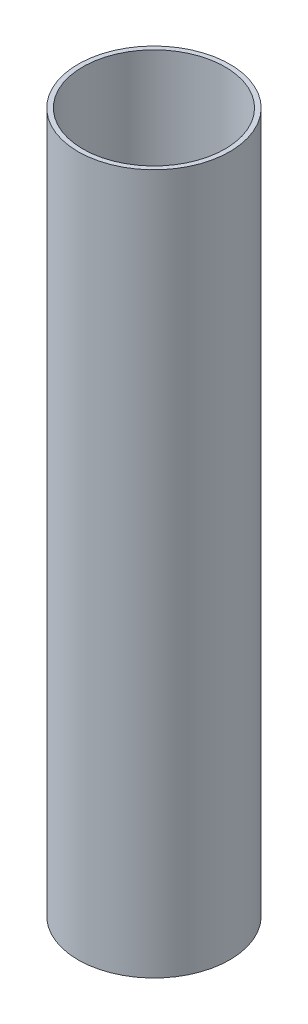
ISO-10303-21;
HEADER;
FILE_DESCRIPTION(('STEP AP214'),'2;1');
FILE_NAME('part.step','',(''),(''),'','','');
FILE_SCHEMA(('AUTOMOTIVE_DESIGN { 1 0 10303 214 1 1 1 1 }'));
ENDSEC;
DATA;
#1=APPLICATION_CONTEXT('core data for automotive mechanical design processes');
#2=APPLICATION_PROTOCOL_DEFINITION('international standard','automotive_design',2000,#1);
#3=PRODUCT_CONTEXT('',#1,'mechanical');
#4=PRODUCT('Part','Part','',(#3));
#5=PRODUCT_RELATED_PRODUCT_CATEGORY('part','',(#4));
#6=PRODUCT_DEFINITION_FORMATION('','',#4);
#7=PRODUCT_DEFINITION_CONTEXT('part definition',#1,'design');
#8=PRODUCT_DEFINITION('design','',#6,#7);
#9=PRODUCT_DEFINITION_SHAPE('','',#8);
#10=(LENGTH_UNIT() NAMED_UNIT(*) SI_UNIT(.MILLI.,.METRE.));
#11=(NAMED_UNIT(*) PLANE_ANGLE_UNIT() SI_UNIT($,.RADIAN.));
#12=(NAMED_UNIT(*) SI_UNIT($,.STERADIAN.) SOLID_ANGLE_UNIT());
#13=UNCERTAINTY_MEASURE_WITH_UNIT(LENGTH_MEASURE(1.E-05),#10,'distance_accuracy_value','');
#14=(GEOMETRIC_REPRESENTATION_CONTEXT(3) GLOBAL_UNCERTAINTY_ASSIGNED_CONTEXT((#13)) GLOBAL_UNIT_ASSIGNED_CONTEXT((#10,
#11,#12)) REPRESENTATION_CONTEXT('',''));
#15=CARTESIAN_POINT('',(0.,0.,0.));
#16=DIRECTION('',(0.,0.,1.));
#17=DIRECTION('',(1.,0.,0.));
#18=AXIS2_PLACEMENT_3D('',#15,#16,#17);
#19=CARTESIAN_POINT('',(0.,300.,0.));
#20=DIRECTION('',(0.,1.,0.));
#21=DIRECTION('',(0.,0.,1.));
#22=AXIS2_PLACEMENT_3D('',#19,#20,#21);
#23=PLANE('',#22);
#24=CARTESIAN_POINT('',(0.,300.,0.));
#25=DIRECTION('',(0.,1.,0.));
#26=DIRECTION('',(0.,0.,1.));
#27=AXIS2_PLACEMENT_3D('',#24,#25,#26);
#28=CIRCLE('',#27,32.5);
#29=CARTESIAN_POINT('',(0.,300.,32.5));
#30=VERTEX_POINT('',#29);
#31=EDGE_CURVE('E10',#30,#30,#28,.T.);
#32=ORIENTED_EDGE('',*,*,#31,.T.);
#33=EDGE_LOOP('',(#32));
#34=FACE_BOUND('',#33,.T.);
#35=CARTESIAN_POINT('',(0.,300.,0.));
#36=DIRECTION('',(0.,1.,0.));
#37=DIRECTION('',(0.,0.,1.));
#38=AXIS2_PLACEMENT_3D('',#35,#36,#37);
#39=CIRCLE('',#38,30.5);
#40=CARTESIAN_POINT('',(0.,300.,30.5));
#41=VERTEX_POINT('',#40);
#42=EDGE_CURVE('E46',#41,#41,#39,.T.);
#43=ORIENTED_EDGE('',*,*,#42,.F.);
#44=EDGE_LOOP('',(#43));
#45=FACE_BOUND('',#44,.T.);
#46=ADVANCED_FACE('F35',(#34,#45),#23,.T.);
#47=CARTESIAN_POINT('',(0.,0.,0.));
#48=DIRECTION('',(0.,1.,0.));
#49=DIRECTION('',(0.,0.,1.));
#50=AXIS2_PLACEMENT_3D('',#47,#48,#49);
#51=PLANE('',#50);
#52=CARTESIAN_POINT('',(0.,0.,0.));
#53=DIRECTION('',(0.,1.,0.));
#54=DIRECTION('',(0.,0.,1.));
#55=AXIS2_PLACEMENT_3D('',#52,#53,#54);
#56=CIRCLE('',#55,32.5);
#57=CARTESIAN_POINT('',(0.,0.,32.5));
#58=VERTEX_POINT('',#57);
#59=EDGE_CURVE('E39',#58,#58,#56,.T.);
#60=ORIENTED_EDGE('',*,*,#59,.F.);
#61=EDGE_LOOP('',(#60));
#62=FACE_BOUND('',#61,.T.);
#63=CARTESIAN_POINT('',(0.,0.,0.));
#64=DIRECTION('',(0.,1.,0.));
#65=DIRECTION('',(0.,0.,1.));
#66=AXIS2_PLACEMENT_3D('',#63,#64,#65);
#67=CIRCLE('',#66,30.5);
#68=CARTESIAN_POINT('',(0.,0.,30.5));
#69=VERTEX_POINT('',#68);
#70=EDGE_CURVE('E48',#69,#69,#67,.T.);
#71=ORIENTED_EDGE('',*,*,#70,.T.);
#72=EDGE_LOOP('',(#71));
#73=FACE_BOUND('',#72,.T.);
#74=ADVANCED_FACE('F58',(#62,#73),#51,.F.);
#75=CARTESIAN_POINT('',(0.,300.,0.));
#76=DIRECTION('',(0.,-1.,0.));
#77=DIRECTION('',(0.,0.,-1.));
#78=AXIS2_PLACEMENT_3D('',#75,#76,#77);
#79=CYLINDRICAL_SURFACE('',#78,32.5);
#80=ORIENTED_EDGE('',*,*,#31,.F.);
#81=EDGE_LOOP('',(#80));
#82=FACE_BOUND('',#81,.T.);
#83=ORIENTED_EDGE('',*,*,#59,.T.);
#84=EDGE_LOOP('',(#83));
#85=FACE_BOUND('',#84,.T.);
#86=ADVANCED_FACE('F37',(#82,#85),#79,.T.);
#87=CARTESIAN_POINT('',(0.,300.,0.));
#88=DIRECTION('',(0.,-1.,0.));
#89=DIRECTION('',(0.,0.,-1.));
#90=AXIS2_PLACEMENT_3D('',#87,#88,#89);
#91=CYLINDRICAL_SURFACE('',#90,30.5);
#92=ORIENTED_EDGE('',*,*,#42,.T.);
#93=EDGE_LOOP('',(#92));
#94=FACE_BOUND('',#93,.T.);
#95=ORIENTED_EDGE('',*,*,#70,.F.);
#96=EDGE_LOOP('',(#95));
#97=FACE_BOUND('',#96,.T.);
#98=ADVANCED_FACE('F54',(#94,#97),#91,.F.);
#99=CLOSED_SHELL('',(#46,#74,#86,#98));
#100=MANIFOLD_SOLID_BREP('B2',#99);
#101=ADVANCED_BREP_SHAPE_REPRESENTATION('',(#18,#100),#14);
#102=SHAPE_DEFINITION_REPRESENTATION(#9,#101);
ENDSEC;
END-ISO-10303-21;
